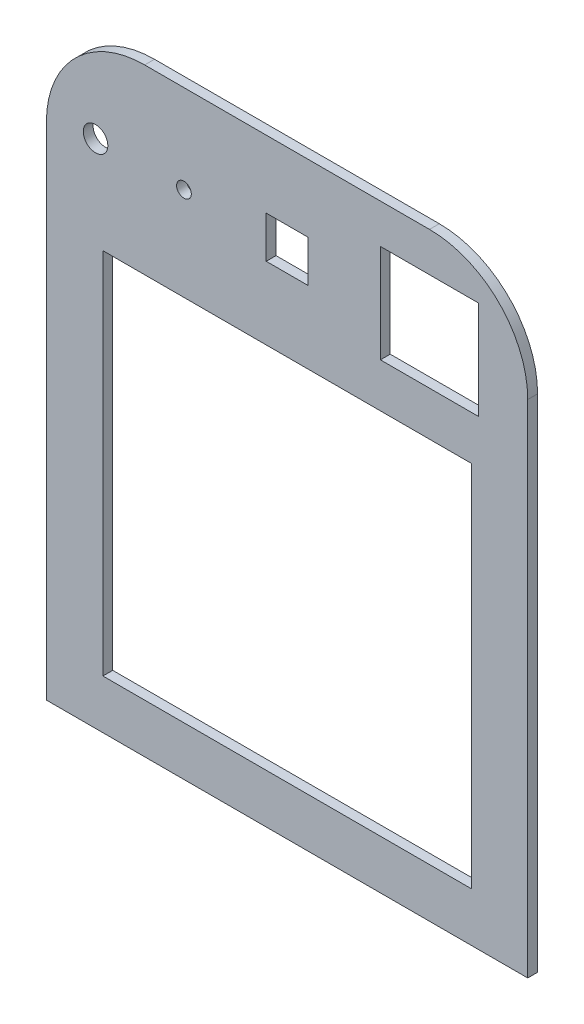
ISO-10303-21;
HEADER;
FILE_DESCRIPTION(('STEP AP214'),'2;1');
FILE_NAME('part.step','',(''),(''),'','','');
FILE_SCHEMA(('AUTOMOTIVE_DESIGN { 1 0 10303 214 1 1 1 1 }'));
ENDSEC;
DATA;
#1=APPLICATION_CONTEXT('core data for automotive mechanical design processes');
#2=APPLICATION_PROTOCOL_DEFINITION('international standard','automotive_design',2000,#1);
#3=PRODUCT_CONTEXT('',#1,'mechanical');
#4=PRODUCT('Part','Part','',(#3));
#5=PRODUCT_RELATED_PRODUCT_CATEGORY('part','',(#4));
#6=PRODUCT_DEFINITION_FORMATION('','',#4);
#7=PRODUCT_DEFINITION_CONTEXT('part definition',#1,'design');
#8=PRODUCT_DEFINITION('design','',#6,#7);
#9=PRODUCT_DEFINITION_SHAPE('','',#8);
#10=(LENGTH_UNIT() NAMED_UNIT(*) SI_UNIT(.MILLI.,.METRE.));
#11=(NAMED_UNIT(*) PLANE_ANGLE_UNIT() SI_UNIT($,.RADIAN.));
#12=(NAMED_UNIT(*) SI_UNIT($,.STERADIAN.) SOLID_ANGLE_UNIT());
#13=UNCERTAINTY_MEASURE_WITH_UNIT(LENGTH_MEASURE(1.E-05),#10,'distance_accuracy_value','');
#14=(GEOMETRIC_REPRESENTATION_CONTEXT(3) GLOBAL_UNCERTAINTY_ASSIGNED_CONTEXT((#13)) GLOBAL_UNIT_ASSIGNED_CONTEXT((#10,
#11,#12)) REPRESENTATION_CONTEXT('',''));
#15=CARTESIAN_POINT('',(0.,0.,0.));
#16=DIRECTION('',(0.,0.,1.));
#17=DIRECTION('',(1.,0.,0.));
#18=AXIS2_PLACEMENT_3D('',#15,#16,#17);
#19=CARTESIAN_POINT('',(49.,61.,2.));
#20=DIRECTION('',(-1.,0.,0.));
#21=DIRECTION('',(0.,-1.,0.));
#22=AXIS2_PLACEMENT_3D('',#19,#20,#21);
#23=PLANE('',#22);
#24=DIRECTION('',(0.,1.,0.));
#25=VECTOR('',#24,1.);
#26=CARTESIAN_POINT('',(49.,61.,0.));
#27=LINE('',#26,#25);
#28=CARTESIAN_POINT('',(49.,-61.,0.));
#29=VERTEX_POINT('',#28);
#30=CARTESIAN_POINT('',(49.,41.,0.));
#31=VERTEX_POINT('',#30);
#32=EDGE_CURVE('E287',#29,#31,#27,.T.);
#33=ORIENTED_EDGE('',*,*,#32,.T.);
#34=DIRECTION('',(0.,0.,-1.));
#35=VECTOR('',#34,1.);
#36=CARTESIAN_POINT('',(49.,41.,2.));
#37=LINE('',#36,#35);
#38=CARTESIAN_POINT('',(49.,41.,2.));
#39=VERTEX_POINT('',#38);
#40=EDGE_CURVE('E365',#31,#39,#37,.F.);
#41=ORIENTED_EDGE('',*,*,#40,.T.);
#42=DIRECTION('',(0.,1.,0.));
#43=VECTOR('',#42,1.);
#44=CARTESIAN_POINT('',(49.,61.,2.));
#45=LINE('',#44,#43);
#46=CARTESIAN_POINT('',(49.,-61.,2.));
#47=VERTEX_POINT('',#46);
#48=EDGE_CURVE('E272',#47,#39,#45,.T.);
#49=ORIENTED_EDGE('',*,*,#48,.F.);
#50=DIRECTION('',(0.,0.,-1.));
#51=VECTOR('',#50,1.);
#52=CARTESIAN_POINT('',(49.,-61.,2.));
#53=LINE('',#52,#51);
#54=EDGE_CURVE('E286',#47,#29,#53,.T.);
#55=ORIENTED_EDGE('',*,*,#54,.T.);
#56=EDGE_LOOP('',(#33,#41,#49,#55));
#57=FACE_BOUND('',#56,.T.);
#58=ADVANCED_FACE('F39',(#57),#23,.F.);
#59=CARTESIAN_POINT('',(-49.,61.,2.));
#60=DIRECTION('',(0.,-1.,0.));
#61=DIRECTION('',(0.,0.,-1.));
#62=AXIS2_PLACEMENT_3D('',#59,#60,#61);
#63=PLANE('',#62);
#64=DIRECTION('',(-1.,0.,0.));
#65=VECTOR('',#64,1.);
#66=CARTESIAN_POINT('',(-49.,61.,0.));
#67=LINE('',#66,#65);
#68=CARTESIAN_POINT('',(29.,61.,0.));
#69=VERTEX_POINT('',#68);
#70=CARTESIAN_POINT('',(-29.,61.,0.));
#71=VERTEX_POINT('',#70);
#72=EDGE_CURVE('E291',#69,#71,#67,.T.);
#73=ORIENTED_EDGE('',*,*,#72,.T.);
#74=DIRECTION('',(0.,0.,-1.));
#75=VECTOR('',#74,1.);
#76=CARTESIAN_POINT('',(-29.,61.,2.));
#77=LINE('',#76,#75);
#78=CARTESIAN_POINT('',(-29.,61.,2.));
#79=VERTEX_POINT('',#78);
#80=EDGE_CURVE('E48',#71,#79,#77,.F.);
#81=ORIENTED_EDGE('',*,*,#80,.T.);
#82=DIRECTION('',(-1.,0.,0.));
#83=VECTOR('',#82,1.);
#84=CARTESIAN_POINT('',(-49.,61.,2.));
#85=LINE('',#84,#83);
#86=CARTESIAN_POINT('',(29.,61.,2.));
#87=VERTEX_POINT('',#86);
#88=EDGE_CURVE('E276',#87,#79,#85,.T.);
#89=ORIENTED_EDGE('',*,*,#88,.F.);
#90=DIRECTION('',(0.,0.,-1.));
#91=VECTOR('',#90,1.);
#92=CARTESIAN_POINT('',(29.,61.,2.));
#93=LINE('',#92,#91);
#94=EDGE_CURVE('E358',#87,#69,#93,.T.);
#95=ORIENTED_EDGE('',*,*,#94,.T.);
#96=EDGE_LOOP('',(#73,#81,#89,#95));
#97=FACE_BOUND('',#96,.T.);
#98=ADVANCED_FACE('F399',(#97),#63,.F.);
#99=CARTESIAN_POINT('',(-49.,61.,2.));
#100=DIRECTION('',(1.,0.,0.));
#101=DIRECTION('',(0.,1.,0.));
#102=AXIS2_PLACEMENT_3D('',#99,#100,#101);
#103=PLANE('',#102);
#104=DIRECTION('',(0.,-1.,0.));
#105=VECTOR('',#104,1.);
#106=CARTESIAN_POINT('',(-49.,61.,2.));
#107=LINE('',#106,#105);
#108=CARTESIAN_POINT('',(-49.,41.,2.));
#109=VERTEX_POINT('',#108);
#110=CARTESIAN_POINT('',(-49.,-61.,2.));
#111=VERTEX_POINT('',#110);
#112=EDGE_CURVE('E280',#109,#111,#107,.T.);
#113=ORIENTED_EDGE('',*,*,#112,.F.);
#114=DIRECTION('',(0.,0.,-1.));
#115=VECTOR('',#114,1.);
#116=CARTESIAN_POINT('',(-49.,41.,2.));
#117=LINE('',#116,#115);
#118=CARTESIAN_POINT('',(-49.,41.,0.));
#119=VERTEX_POINT('',#118);
#120=EDGE_CURVE('E371',#109,#119,#117,.T.);
#121=ORIENTED_EDGE('',*,*,#120,.T.);
#122=DIRECTION('',(0.,-1.,0.));
#123=VECTOR('',#122,1.);
#124=CARTESIAN_POINT('',(-49.,61.,0.));
#125=LINE('',#124,#123);
#126=CARTESIAN_POINT('',(-49.,-61.,0.));
#127=VERTEX_POINT('',#126);
#128=EDGE_CURVE('E295',#119,#127,#125,.T.);
#129=ORIENTED_EDGE('',*,*,#128,.T.);
#130=DIRECTION('',(0.,0.,-1.));
#131=VECTOR('',#130,1.);
#132=CARTESIAN_POINT('',(-49.,-61.,2.));
#133=LINE('',#132,#131);
#134=EDGE_CURVE('E303',#111,#127,#133,.T.);
#135=ORIENTED_EDGE('',*,*,#134,.F.);
#136=EDGE_LOOP('',(#113,#121,#129,#135));
#137=FACE_BOUND('',#136,.T.);
#138=ADVANCED_FACE('F380',(#137),#103,.F.);
#139=CARTESIAN_POINT('',(-49.,-61.,2.));
#140=DIRECTION('',(0.,1.,0.));
#141=DIRECTION('',(0.,0.,1.));
#142=AXIS2_PLACEMENT_3D('',#139,#140,#141);
#143=PLANE('',#142);
#144=DIRECTION('',(1.,0.,0.));
#145=VECTOR('',#144,1.);
#146=CARTESIAN_POINT('',(-49.,-61.,0.));
#147=LINE('',#146,#145);
#148=EDGE_CURVE('E277',#127,#29,#147,.T.);
#149=ORIENTED_EDGE('',*,*,#148,.T.);
#150=ORIENTED_EDGE('',*,*,#54,.F.);
#151=DIRECTION('',(1.,0.,0.));
#152=VECTOR('',#151,1.);
#153=CARTESIAN_POINT('',(-49.,-61.,2.));
#154=LINE('',#153,#152);
#155=EDGE_CURVE('E283',#111,#47,#154,.T.);
#156=ORIENTED_EDGE('',*,*,#155,.F.);
#157=ORIENTED_EDGE('',*,*,#134,.T.);
#158=EDGE_LOOP('',(#149,#150,#156,#157));
#159=FACE_BOUND('',#158,.T.);
#160=ADVANCED_FACE('F389',(#159),#143,.F.);
#161=CARTESIAN_POINT('',(0.,0.,2.));
#162=DIRECTION('',(0.,0.,1.));
#163=DIRECTION('',(1.,0.,0.));
#164=AXIS2_PLACEMENT_3D('',#161,#162,#163);
#165=PLANE('',#164);
#166=DIRECTION('',(-1.,0.,0.));
#167=VECTOR('',#166,1.);
#168=CARTESIAN_POINT('',(37.5,24.,2.));
#169=LINE('',#168,#167);
#170=CARTESIAN_POINT('',(37.5,24.,2.));
#171=VERTEX_POINT('',#170);
#172=CARTESIAN_POINT('',(-37.5,24.,2.));
#173=VERTEX_POINT('',#172);
#174=EDGE_CURVE('E188',#171,#173,#169,.T.);
#175=ORIENTED_EDGE('',*,*,#174,.F.);
#176=DIRECTION('',(0.,1.,0.));
#177=VECTOR('',#176,1.);
#178=CARTESIAN_POINT('',(37.5,-51.,2.));
#179=LINE('',#178,#177);
#180=CARTESIAN_POINT('',(37.5,-51.,2.));
#181=VERTEX_POINT('',#180);
#182=EDGE_CURVE('E193',#181,#171,#179,.T.);
#183=ORIENTED_EDGE('',*,*,#182,.F.);
#184=DIRECTION('',(1.,0.,0.));
#185=VECTOR('',#184,1.);
#186=CARTESIAN_POINT('',(-37.5,-51.,2.));
#187=LINE('',#186,#185);
#188=CARTESIAN_POINT('',(-37.5,-51.,2.));
#189=VERTEX_POINT('',#188);
#190=EDGE_CURVE('E170',#189,#181,#187,.T.);
#191=ORIENTED_EDGE('',*,*,#190,.F.);
#192=DIRECTION('',(0.,-1.,0.));
#193=VECTOR('',#192,1.);
#194=CARTESIAN_POINT('',(-37.5,24.,2.));
#195=LINE('',#194,#193);
#196=EDGE_CURVE('E182',#173,#189,#195,.T.);
#197=ORIENTED_EDGE('',*,*,#196,.F.);
#198=EDGE_LOOP('',(#175,#183,#191,#197));
#199=FACE_BOUND('',#198,.T.);
#200=DIRECTION('',(-1.,0.,0.));
#201=VECTOR('',#200,1.);
#202=CARTESIAN_POINT('',(4.25,47.25,2.));
#203=LINE('',#202,#201);
#204=CARTESIAN_POINT('',(4.25,47.25,2.));
#205=VERTEX_POINT('',#204);
#206=CARTESIAN_POINT('',(-4.25,47.25,2.));
#207=VERTEX_POINT('',#206);
#208=EDGE_CURVE('E208',#205,#207,#203,.T.);
#209=ORIENTED_EDGE('',*,*,#208,.F.);
#210=DIRECTION('',(0.,1.,0.));
#211=VECTOR('',#210,1.);
#212=CARTESIAN_POINT('',(4.25,38.75,2.));
#213=LINE('',#212,#211);
#214=CARTESIAN_POINT('',(4.25,38.75,2.));
#215=VERTEX_POINT('',#214);
#216=EDGE_CURVE('E220',#215,#205,#213,.T.);
#217=ORIENTED_EDGE('',*,*,#216,.F.);
#218=DIRECTION('',(1.,0.,0.));
#219=VECTOR('',#218,1.);
#220=CARTESIAN_POINT('',(-4.25,38.75,2.));
#221=LINE('',#220,#219);
#222=CARTESIAN_POINT('',(-4.25,38.75,2.));
#223=VERTEX_POINT('',#222);
#224=EDGE_CURVE('E216',#223,#215,#221,.T.);
#225=ORIENTED_EDGE('',*,*,#224,.F.);
#226=DIRECTION('',(0.,-1.,0.));
#227=VECTOR('',#226,1.);
#228=CARTESIAN_POINT('',(-4.25,47.25,2.));
#229=LINE('',#228,#227);
#230=EDGE_CURVE('E211',#207,#223,#229,.T.);
#231=ORIENTED_EDGE('',*,*,#230,.F.);
#232=EDGE_LOOP('',(#209,#217,#225,#231));
#233=FACE_BOUND('',#232,.T.);
#234=DIRECTION('',(-1.,0.,0.));
#235=VECTOR('',#234,1.);
#236=CARTESIAN_POINT('',(39.,53.,2.));
#237=LINE('',#236,#235);
#238=CARTESIAN_POINT('',(39.,53.,2.));
#239=VERTEX_POINT('',#238);
#240=CARTESIAN_POINT('',(19.,53.,2.));
#241=VERTEX_POINT('',#240);
#242=EDGE_CURVE('E237',#239,#241,#237,.T.);
#243=ORIENTED_EDGE('',*,*,#242,.F.);
#244=DIRECTION('',(0.,1.,0.));
#245=VECTOR('',#244,1.);
#246=CARTESIAN_POINT('',(39.,33.,2.));
#247=LINE('',#246,#245);
#248=CARTESIAN_POINT('',(39.,33.,2.));
#249=VERTEX_POINT('',#248);
#250=EDGE_CURVE('E249',#249,#239,#247,.T.);
#251=ORIENTED_EDGE('',*,*,#250,.F.);
#252=DIRECTION('',(1.,0.,0.));
#253=VECTOR('',#252,1.);
#254=CARTESIAN_POINT('',(19.,33.,2.));
#255=LINE('',#254,#253);
#256=CARTESIAN_POINT('',(19.,33.,2.));
#257=VERTEX_POINT('',#256);
#258=EDGE_CURVE('E245',#257,#249,#255,.T.);
#259=ORIENTED_EDGE('',*,*,#258,.F.);
#260=DIRECTION('',(0.,-1.,0.));
#261=VECTOR('',#260,1.);
#262=CARTESIAN_POINT('',(19.,53.,2.));
#263=LINE('',#262,#261);
#264=EDGE_CURVE('E240',#241,#257,#263,.T.);
#265=ORIENTED_EDGE('',*,*,#264,.F.);
#266=EDGE_LOOP('',(#243,#251,#259,#265));
#267=FACE_BOUND('',#266,.T.);
#268=CARTESIAN_POINT('',(-21.,43.,2.));
#269=DIRECTION('',(0.,0.,1.));
#270=DIRECTION('',(1.,0.,0.));
#271=AXIS2_PLACEMENT_3D('',#268,#269,#270);
#272=CIRCLE('',#271,1.5);
#273=CARTESIAN_POINT('',(-19.5,43.,2.));
#274=VERTEX_POINT('',#273);
#275=EDGE_CURVE('E241',#274,#274,#272,.T.);
#276=ORIENTED_EDGE('',*,*,#275,.F.);
#277=EDGE_LOOP('',(#276));
#278=FACE_BOUND('',#277,.T.);
#279=CARTESIAN_POINT('',(-39.,43.,2.));
#280=DIRECTION('',(0.,0.,1.));
#281=DIRECTION('',(1.,0.,0.));
#282=AXIS2_PLACEMENT_3D('',#279,#280,#281);
#283=CIRCLE('',#282,2.5);
#284=CARTESIAN_POINT('',(-36.5,43.,2.));
#285=VERTEX_POINT('',#284);
#286=EDGE_CURVE('E268',#285,#285,#283,.T.);
#287=ORIENTED_EDGE('',*,*,#286,.F.);
#288=EDGE_LOOP('',(#287));
#289=FACE_BOUND('',#288,.T.);
#290=ORIENTED_EDGE('',*,*,#88,.T.);
#291=CARTESIAN_POINT('',(-29.,41.,2.));
#292=DIRECTION('',(0.,0.,1.));
#293=DIRECTION('',(1.,0.,0.));
#294=AXIS2_PLACEMENT_3D('',#291,#292,#293);
#295=CIRCLE('',#294,20.);
#296=EDGE_CURVE('E11',#79,#109,#295,.T.);
#297=ORIENTED_EDGE('',*,*,#296,.T.);
#298=ORIENTED_EDGE('',*,*,#112,.T.);
#299=ORIENTED_EDGE('',*,*,#155,.T.);
#300=ORIENTED_EDGE('',*,*,#48,.T.);
#301=CARTESIAN_POINT('',(29.,41.,2.));
#302=DIRECTION('',(0.,0.,1.));
#303=DIRECTION('',(1.,0.,0.));
#304=AXIS2_PLACEMENT_3D('',#301,#302,#303);
#305=CIRCLE('',#304,20.);
#306=EDGE_CURVE('E368',#39,#87,#305,.T.);
#307=ORIENTED_EDGE('',*,*,#306,.T.);
#308=EDGE_LOOP('',(#290,#297,#298,#299,#300,#307));
#309=FACE_BOUND('',#308,.T.);
#310=ADVANCED_FACE('F190',(#199,#233,#267,#278,#289,#309),#165,.T.);
#311=CARTESIAN_POINT('',(0.,0.,0.));
#312=DIRECTION('',(0.,0.,1.));
#313=DIRECTION('',(1.,0.,0.));
#314=AXIS2_PLACEMENT_3D('',#311,#312,#313);
#315=PLANE('',#314);
#316=DIRECTION('',(0.,1.,0.));
#317=VECTOR('',#316,1.);
#318=CARTESIAN_POINT('',(37.5,0.,0.));
#319=LINE('',#318,#317);
#320=CARTESIAN_POINT('',(37.5,-51.,0.));
#321=VERTEX_POINT('',#320);
#322=CARTESIAN_POINT('',(37.5,24.,0.));
#323=VERTEX_POINT('',#322);
#324=EDGE_CURVE('E350',#321,#323,#319,.T.);
#325=ORIENTED_EDGE('',*,*,#324,.T.);
#326=DIRECTION('',(-1.,0.,0.));
#327=VECTOR('',#326,1.);
#328=CARTESIAN_POINT('',(0.,24.,0.));
#329=LINE('',#328,#327);
#330=CARTESIAN_POINT('',(-37.5,24.,0.));
#331=VERTEX_POINT('',#330);
#332=EDGE_CURVE('E354',#323,#331,#329,.T.);
#333=ORIENTED_EDGE('',*,*,#332,.T.);
#334=DIRECTION('',(0.,-1.,0.));
#335=VECTOR('',#334,1.);
#336=CARTESIAN_POINT('',(-37.5,0.,0.));
#337=LINE('',#336,#335);
#338=CARTESIAN_POINT('',(-37.5,-51.,0.));
#339=VERTEX_POINT('',#338);
#340=EDGE_CURVE('E345',#331,#339,#337,.T.);
#341=ORIENTED_EDGE('',*,*,#340,.T.);
#342=DIRECTION('',(1.,0.,0.));
#343=VECTOR('',#342,1.);
#344=CARTESIAN_POINT('',(0.,-51.,0.));
#345=LINE('',#344,#343);
#346=EDGE_CURVE('E173',#339,#321,#345,.T.);
#347=ORIENTED_EDGE('',*,*,#346,.T.);
#348=EDGE_LOOP('',(#325,#333,#341,#347));
#349=FACE_BOUND('',#348,.T.);
#350=DIRECTION('',(0.,1.,0.));
#351=VECTOR('',#350,1.);
#352=CARTESIAN_POINT('',(4.24999999999999,0.,0.));
#353=LINE('',#352,#351);
#354=CARTESIAN_POINT('',(4.25,38.75,0.));
#355=VERTEX_POINT('',#354);
#356=CARTESIAN_POINT('',(4.25,47.25,0.));
#357=VERTEX_POINT('',#356);
#358=EDGE_CURVE('E337',#355,#357,#353,.T.);
#359=ORIENTED_EDGE('',*,*,#358,.T.);
#360=DIRECTION('',(-1.,0.,0.));
#361=VECTOR('',#360,1.);
#362=CARTESIAN_POINT('',(0.,47.25,0.));
#363=LINE('',#362,#361);
#364=CARTESIAN_POINT('',(-4.25,47.25,0.));
#365=VERTEX_POINT('',#364);
#366=EDGE_CURVE('E341',#357,#365,#363,.T.);
#367=ORIENTED_EDGE('',*,*,#366,.T.);
#368=DIRECTION('',(0.,-1.,0.));
#369=VECTOR('',#368,1.);
#370=CARTESIAN_POINT('',(-4.24999999999999,0.,0.));
#371=LINE('',#370,#369);
#372=CARTESIAN_POINT('',(-4.25,38.75,0.));
#373=VERTEX_POINT('',#372);
#374=EDGE_CURVE('E329',#365,#373,#371,.T.);
#375=ORIENTED_EDGE('',*,*,#374,.T.);
#376=DIRECTION('',(1.,0.,0.));
#377=VECTOR('',#376,1.);
#378=CARTESIAN_POINT('',(0.,38.75,0.));
#379=LINE('',#378,#377);
#380=EDGE_CURVE('E333',#373,#355,#379,.T.);
#381=ORIENTED_EDGE('',*,*,#380,.T.);
#382=EDGE_LOOP('',(#359,#367,#375,#381));
#383=FACE_BOUND('',#382,.T.);
#384=DIRECTION('',(0.,1.,0.));
#385=VECTOR('',#384,1.);
#386=CARTESIAN_POINT('',(39.,0.,0.));
#387=LINE('',#386,#385);
#388=CARTESIAN_POINT('',(39.,33.,0.));
#389=VERTEX_POINT('',#388);
#390=CARTESIAN_POINT('',(39.,53.,0.));
#391=VERTEX_POINT('',#390);
#392=EDGE_CURVE('E321',#389,#391,#387,.T.);
#393=ORIENTED_EDGE('',*,*,#392,.T.);
#394=DIRECTION('',(-1.,0.,0.));
#395=VECTOR('',#394,1.);
#396=CARTESIAN_POINT('',(0.,53.,0.));
#397=LINE('',#396,#395);
#398=CARTESIAN_POINT('',(19.,53.,0.));
#399=VERTEX_POINT('',#398);
#400=EDGE_CURVE('E325',#391,#399,#397,.T.);
#401=ORIENTED_EDGE('',*,*,#400,.T.);
#402=DIRECTION('',(0.,-1.,0.));
#403=VECTOR('',#402,1.);
#404=CARTESIAN_POINT('',(19.,0.,0.));
#405=LINE('',#404,#403);
#406=CARTESIAN_POINT('',(19.,33.,0.));
#407=VERTEX_POINT('',#406);
#408=EDGE_CURVE('E307',#399,#407,#405,.T.);
#409=ORIENTED_EDGE('',*,*,#408,.T.);
#410=DIRECTION('',(1.,0.,0.));
#411=VECTOR('',#410,1.);
#412=CARTESIAN_POINT('',(0.,33.,0.));
#413=LINE('',#412,#411);
#414=EDGE_CURVE('E317',#407,#389,#413,.T.);
#415=ORIENTED_EDGE('',*,*,#414,.T.);
#416=EDGE_LOOP('',(#393,#401,#409,#415));
#417=FACE_BOUND('',#416,.T.);
#418=CARTESIAN_POINT('',(-21.,43.,0.));
#419=DIRECTION('',(0.,0.,1.));
#420=DIRECTION('',(1.,0.,0.));
#421=AXIS2_PLACEMENT_3D('',#418,#419,#420);
#422=CIRCLE('',#421,1.5);
#423=CARTESIAN_POINT('',(-19.5,43.,0.));
#424=VERTEX_POINT('',#423);
#425=EDGE_CURVE('E292',#424,#424,#422,.T.);
#426=ORIENTED_EDGE('',*,*,#425,.T.);
#427=EDGE_LOOP('',(#426));
#428=FACE_BOUND('',#427,.T.);
#429=CARTESIAN_POINT('',(-39.,43.,0.));
#430=DIRECTION('',(0.,0.,1.));
#431=DIRECTION('',(1.,0.,0.));
#432=AXIS2_PLACEMENT_3D('',#429,#430,#431);
#433=CIRCLE('',#432,2.5);
#434=CARTESIAN_POINT('',(-36.5,43.,0.));
#435=VERTEX_POINT('',#434);
#436=EDGE_CURVE('E203',#435,#435,#433,.T.);
#437=ORIENTED_EDGE('',*,*,#436,.T.);
#438=EDGE_LOOP('',(#437));
#439=FACE_BOUND('',#438,.T.);
#440=ORIENTED_EDGE('',*,*,#128,.F.);
#441=CARTESIAN_POINT('',(-29.,41.,0.));
#442=DIRECTION('',(0.,0.,1.));
#443=DIRECTION('',(1.,0.,0.));
#444=AXIS2_PLACEMENT_3D('',#441,#442,#443);
#445=CIRCLE('',#444,20.);
#446=EDGE_CURVE('E62',#119,#71,#445,.F.);
#447=ORIENTED_EDGE('',*,*,#446,.T.);
#448=ORIENTED_EDGE('',*,*,#72,.F.);
#449=CARTESIAN_POINT('',(29.,41.,0.));
#450=DIRECTION('',(0.,0.,1.));
#451=DIRECTION('',(1.,0.,0.));
#452=AXIS2_PLACEMENT_3D('',#449,#450,#451);
#453=CIRCLE('',#452,20.);
#454=EDGE_CURVE('E362',#69,#31,#453,.F.);
#455=ORIENTED_EDGE('',*,*,#454,.T.);
#456=ORIENTED_EDGE('',*,*,#32,.F.);
#457=ORIENTED_EDGE('',*,*,#148,.F.);
#458=EDGE_LOOP('',(#440,#447,#448,#455,#456,#457));
#459=FACE_BOUND('',#458,.T.);
#460=ADVANCED_FACE('F385',(#349,#383,#417,#428,#439,#459),#315,.F.);
#461=CARTESIAN_POINT('',(-39.,43.,-1.));
#462=DIRECTION('',(0.,0.,1.));
#463=DIRECTION('',(1.,0.,0.));
#464=AXIS2_PLACEMENT_3D('',#461,#462,#463);
#465=CYLINDRICAL_SURFACE('',#464,2.5);
#466=ORIENTED_EDGE('',*,*,#286,.T.);
#467=EDGE_LOOP('',(#466));
#468=FACE_BOUND('',#467,.T.);
#469=ORIENTED_EDGE('',*,*,#436,.F.);
#470=EDGE_LOOP('',(#469));
#471=FACE_BOUND('',#470,.T.);
#472=ADVANCED_FACE('F417',(#468,#471),#465,.F.);
#473=CARTESIAN_POINT('',(-21.,43.,-1.));
#474=DIRECTION('',(0.,0.,1.));
#475=DIRECTION('',(1.,0.,0.));
#476=AXIS2_PLACEMENT_3D('',#473,#474,#475);
#477=CYLINDRICAL_SURFACE('',#476,1.5);
#478=ORIENTED_EDGE('',*,*,#275,.T.);
#479=EDGE_LOOP('',(#478));
#480=FACE_BOUND('',#479,.T.);
#481=ORIENTED_EDGE('',*,*,#425,.F.);
#482=EDGE_LOOP('',(#481));
#483=FACE_BOUND('',#482,.T.);
#484=ADVANCED_FACE('F423',(#480,#483),#477,.F.);
#485=CARTESIAN_POINT('',(39.,53.,-1.));
#486=DIRECTION('',(0.,1.,0.));
#487=DIRECTION('',(0.,0.,1.));
#488=AXIS2_PLACEMENT_3D('',#485,#486,#487);
#489=PLANE('',#488);
#490=DIRECTION('',(0.,0.,1.));
#491=VECTOR('',#490,1.);
#492=CARTESIAN_POINT('',(39.,53.,-1.));
#493=LINE('',#492,#491);
#494=EDGE_CURVE('E212',#391,#239,#493,.T.);
#495=ORIENTED_EDGE('',*,*,#494,.T.);
#496=ORIENTED_EDGE('',*,*,#242,.T.);
#497=DIRECTION('',(0.,0.,1.));
#498=VECTOR('',#497,1.);
#499=CARTESIAN_POINT('',(19.,53.,-1.));
#500=LINE('',#499,#498);
#501=EDGE_CURVE('E253',#399,#241,#500,.T.);
#502=ORIENTED_EDGE('',*,*,#501,.F.);
#503=ORIENTED_EDGE('',*,*,#400,.F.);
#504=EDGE_LOOP('',(#495,#496,#502,#503));
#505=FACE_BOUND('',#504,.T.);
#506=ADVANCED_FACE('F427',(#505),#489,.F.);
#507=CARTESIAN_POINT('',(39.,33.,-1.));
#508=DIRECTION('',(1.,0.,0.));
#509=DIRECTION('',(0.,1.,0.));
#510=AXIS2_PLACEMENT_3D('',#507,#508,#509);
#511=PLANE('',#510);
#512=DIRECTION('',(0.,0.,1.));
#513=VECTOR('',#512,1.);
#514=CARTESIAN_POINT('',(39.,33.,-1.));
#515=LINE('',#514,#513);
#516=EDGE_CURVE('E256',#389,#249,#515,.T.);
#517=ORIENTED_EDGE('',*,*,#516,.T.);
#518=ORIENTED_EDGE('',*,*,#250,.T.);
#519=ORIENTED_EDGE('',*,*,#494,.F.);
#520=ORIENTED_EDGE('',*,*,#392,.F.);
#521=EDGE_LOOP('',(#517,#518,#519,#520));
#522=FACE_BOUND('',#521,.T.);
#523=ADVANCED_FACE('F431',(#522),#511,.F.);
#524=CARTESIAN_POINT('',(19.,33.,-1.));
#525=DIRECTION('',(0.,-1.,0.));
#526=DIRECTION('',(0.,0.,-1.));
#527=AXIS2_PLACEMENT_3D('',#524,#525,#526);
#528=PLANE('',#527);
#529=DIRECTION('',(0.,0.,1.));
#530=VECTOR('',#529,1.);
#531=CARTESIAN_POINT('',(19.,33.,-1.));
#532=LINE('',#531,#530);
#533=EDGE_CURVE('E259',#407,#257,#532,.T.);
#534=ORIENTED_EDGE('',*,*,#533,.T.);
#535=ORIENTED_EDGE('',*,*,#258,.T.);
#536=ORIENTED_EDGE('',*,*,#516,.F.);
#537=ORIENTED_EDGE('',*,*,#414,.F.);
#538=EDGE_LOOP('',(#534,#535,#536,#537));
#539=FACE_BOUND('',#538,.T.);
#540=ADVANCED_FACE('F437',(#539),#528,.F.);
#541=CARTESIAN_POINT('',(19.,53.,-1.));
#542=DIRECTION('',(-1.,0.,0.));
#543=DIRECTION('',(0.,0.,1.));
#544=AXIS2_PLACEMENT_3D('',#541,#542,#543);
#545=PLANE('',#544);
#546=ORIENTED_EDGE('',*,*,#501,.T.);
#547=ORIENTED_EDGE('',*,*,#264,.T.);
#548=ORIENTED_EDGE('',*,*,#533,.F.);
#549=ORIENTED_EDGE('',*,*,#408,.F.);
#550=EDGE_LOOP('',(#546,#547,#548,#549));
#551=FACE_BOUND('',#550,.T.);
#552=ADVANCED_FACE('F433',(#551),#545,.F.);
#553=CARTESIAN_POINT('',(4.25,47.25,-1.));
#554=DIRECTION('',(0.,1.,0.));
#555=DIRECTION('',(0.,0.,1.));
#556=AXIS2_PLACEMENT_3D('',#553,#554,#555);
#557=PLANE('',#556);
#558=DIRECTION('',(0.,0.,1.));
#559=VECTOR('',#558,1.);
#560=CARTESIAN_POINT('',(4.25,47.25,-1.));
#561=LINE('',#560,#559);
#562=EDGE_CURVE('E225',#357,#205,#561,.T.);
#563=ORIENTED_EDGE('',*,*,#562,.T.);
#564=ORIENTED_EDGE('',*,*,#208,.T.);
#565=DIRECTION('',(0.,0.,1.));
#566=VECTOR('',#565,1.);
#567=CARTESIAN_POINT('',(-4.25,47.25,-1.));
#568=LINE('',#567,#566);
#569=EDGE_CURVE('E224',#365,#207,#568,.T.);
#570=ORIENTED_EDGE('',*,*,#569,.F.);
#571=ORIENTED_EDGE('',*,*,#366,.F.);
#572=EDGE_LOOP('',(#563,#564,#570,#571));
#573=FACE_BOUND('',#572,.T.);
#574=ADVANCED_FACE('F436',(#573),#557,.F.);
#575=CARTESIAN_POINT('',(4.25,38.75,-1.));
#576=DIRECTION('',(1.,0.,0.));
#577=DIRECTION('',(0.,1.,0.));
#578=AXIS2_PLACEMENT_3D('',#575,#576,#577);
#579=PLANE('',#578);
#580=DIRECTION('',(0.,0.,1.));
#581=VECTOR('',#580,1.);
#582=CARTESIAN_POINT('',(4.25,38.75,-1.));
#583=LINE('',#582,#581);
#584=EDGE_CURVE('E228',#355,#215,#583,.T.);
#585=ORIENTED_EDGE('',*,*,#584,.T.);
#586=ORIENTED_EDGE('',*,*,#216,.T.);
#587=ORIENTED_EDGE('',*,*,#562,.F.);
#588=ORIENTED_EDGE('',*,*,#358,.F.);
#589=EDGE_LOOP('',(#585,#586,#587,#588));
#590=FACE_BOUND('',#589,.T.);
#591=ADVANCED_FACE('F447',(#590),#579,.F.);
#592=CARTESIAN_POINT('',(-4.25,38.75,-1.));
#593=DIRECTION('',(0.,-1.,0.));
#594=DIRECTION('',(0.,0.,-1.));
#595=AXIS2_PLACEMENT_3D('',#592,#593,#594);
#596=PLANE('',#595);
#597=DIRECTION('',(0.,0.,1.));
#598=VECTOR('',#597,1.);
#599=CARTESIAN_POINT('',(-4.25,38.75,-1.));
#600=LINE('',#599,#598);
#601=EDGE_CURVE('E231',#373,#223,#600,.T.);
#602=ORIENTED_EDGE('',*,*,#601,.T.);
#603=ORIENTED_EDGE('',*,*,#224,.T.);
#604=ORIENTED_EDGE('',*,*,#584,.F.);
#605=ORIENTED_EDGE('',*,*,#380,.F.);
#606=EDGE_LOOP('',(#602,#603,#604,#605));
#607=FACE_BOUND('',#606,.T.);
#608=ADVANCED_FACE('F453',(#607),#596,.F.);
#609=CARTESIAN_POINT('',(-4.25,47.25,-1.));
#610=DIRECTION('',(-1.,0.,0.));
#611=DIRECTION('',(0.,-1.,0.));
#612=AXIS2_PLACEMENT_3D('',#609,#610,#611);
#613=PLANE('',#612);
#614=ORIENTED_EDGE('',*,*,#569,.T.);
#615=ORIENTED_EDGE('',*,*,#230,.T.);
#616=ORIENTED_EDGE('',*,*,#601,.F.);
#617=ORIENTED_EDGE('',*,*,#374,.F.);
#618=EDGE_LOOP('',(#614,#615,#616,#617));
#619=FACE_BOUND('',#618,.T.);
#620=ADVANCED_FACE('F449',(#619),#613,.F.);
#621=CARTESIAN_POINT('',(37.5,24.,-1.));
#622=DIRECTION('',(0.,1.,0.));
#623=DIRECTION('',(-1.,0.,0.));
#624=AXIS2_PLACEMENT_3D('',#621,#622,#623);
#625=PLANE('',#624);
#626=DIRECTION('',(0.,0.,1.));
#627=VECTOR('',#626,1.);
#628=CARTESIAN_POINT('',(37.5,24.,-1.));
#629=LINE('',#628,#627);
#630=EDGE_CURVE('E200',#323,#171,#629,.T.);
#631=ORIENTED_EDGE('',*,*,#630,.T.);
#632=ORIENTED_EDGE('',*,*,#174,.T.);
#633=DIRECTION('',(0.,0.,1.));
#634=VECTOR('',#633,1.);
#635=CARTESIAN_POINT('',(-37.5,24.,-1.));
#636=LINE('',#635,#634);
#637=EDGE_CURVE('E178',#331,#173,#636,.T.);
#638=ORIENTED_EDGE('',*,*,#637,.F.);
#639=ORIENTED_EDGE('',*,*,#332,.F.);
#640=EDGE_LOOP('',(#631,#632,#638,#639));
#641=FACE_BOUND('',#640,.T.);
#642=ADVANCED_FACE('F452',(#641),#625,.F.);
#643=CARTESIAN_POINT('',(37.5,-51.,-1.));
#644=DIRECTION('',(1.,0.,0.));
#645=DIRECTION('',(0.,1.,0.));
#646=AXIS2_PLACEMENT_3D('',#643,#644,#645);
#647=PLANE('',#646);
#648=DIRECTION('',(0.,0.,1.));
#649=VECTOR('',#648,1.);
#650=CARTESIAN_POINT('',(37.5,-51.,-1.));
#651=LINE('',#650,#649);
#652=EDGE_CURVE('E177',#321,#181,#651,.T.);
#653=ORIENTED_EDGE('',*,*,#652,.T.);
#654=ORIENTED_EDGE('',*,*,#182,.T.);
#655=ORIENTED_EDGE('',*,*,#630,.F.);
#656=ORIENTED_EDGE('',*,*,#324,.F.);
#657=EDGE_LOOP('',(#653,#654,#655,#656));
#658=FACE_BOUND('',#657,.T.);
#659=ADVANCED_FACE('F463',(#658),#647,.F.);
#660=CARTESIAN_POINT('',(-37.5,-51.,-1.));
#661=DIRECTION('',(0.,-1.,0.));
#662=DIRECTION('',(0.,0.,-1.));
#663=AXIS2_PLACEMENT_3D('',#660,#661,#662);
#664=PLANE('',#663);
#665=DIRECTION('',(0.,0.,1.));
#666=VECTOR('',#665,1.);
#667=CARTESIAN_POINT('',(-37.5,-51.,-1.));
#668=LINE('',#667,#666);
#669=EDGE_CURVE('E165',#339,#189,#668,.T.);
#670=ORIENTED_EDGE('',*,*,#669,.T.);
#671=ORIENTED_EDGE('',*,*,#190,.T.);
#672=ORIENTED_EDGE('',*,*,#652,.F.);
#673=ORIENTED_EDGE('',*,*,#346,.F.);
#674=EDGE_LOOP('',(#670,#671,#672,#673));
#675=FACE_BOUND('',#674,.T.);
#676=ADVANCED_FACE('F167',(#675),#664,.F.);
#677=CARTESIAN_POINT('',(-37.5,24.,-1.));
#678=DIRECTION('',(-1.,0.,0.));
#679=DIRECTION('',(0.,-1.,0.));
#680=AXIS2_PLACEMENT_3D('',#677,#678,#679);
#681=PLANE('',#680);
#682=ORIENTED_EDGE('',*,*,#637,.T.);
#683=ORIENTED_EDGE('',*,*,#196,.T.);
#684=ORIENTED_EDGE('',*,*,#669,.F.);
#685=ORIENTED_EDGE('',*,*,#340,.F.);
#686=EDGE_LOOP('',(#682,#683,#684,#685));
#687=FACE_BOUND('',#686,.T.);
#688=ADVANCED_FACE('F183',(#687),#681,.F.);
#689=CARTESIAN_POINT('',(29.,41.,2.));
#690=DIRECTION('',(0.,0.,-1.));
#691=DIRECTION('',(-1.,0.,0.));
#692=AXIS2_PLACEMENT_3D('',#689,#690,#691);
#693=CYLINDRICAL_SURFACE('',#692,20.);
#694=ORIENTED_EDGE('',*,*,#306,.F.);
#695=ORIENTED_EDGE('',*,*,#40,.F.);
#696=ORIENTED_EDGE('',*,*,#454,.F.);
#697=ORIENTED_EDGE('',*,*,#94,.F.);
#698=EDGE_LOOP('',(#694,#695,#696,#697));
#699=FACE_BOUND('',#698,.T.);
#700=ADVANCED_FACE('F398',(#699),#693,.T.);
#701=CARTESIAN_POINT('',(-29.,41.,2.));
#702=DIRECTION('',(0.,0.,-1.));
#703=DIRECTION('',(-1.,0.,0.));
#704=AXIS2_PLACEMENT_3D('',#701,#702,#703);
#705=CYLINDRICAL_SURFACE('',#704,20.);
#706=ORIENTED_EDGE('',*,*,#296,.F.);
#707=ORIENTED_EDGE('',*,*,#80,.F.);
#708=ORIENTED_EDGE('',*,*,#446,.F.);
#709=ORIENTED_EDGE('',*,*,#120,.F.);
#710=EDGE_LOOP('',(#706,#707,#708,#709));
#711=FACE_BOUND('',#710,.T.);
#712=ADVANCED_FACE('F41',(#711),#705,.T.);
#713=CLOSED_SHELL('',(#58,#98,#138,#160,#310,#460,#472,#484,#506,#523,#540,#552,#574,#591,#608,
#620,#642,#659,#676,#688,#700,#712));
#714=MANIFOLD_SOLID_BREP('B2',#713);
#715=ADVANCED_BREP_SHAPE_REPRESENTATION('',(#18,#714),#14);
#716=SHAPE_DEFINITION_REPRESENTATION(#9,#715);
ENDSEC;
END-ISO-10303-21;
